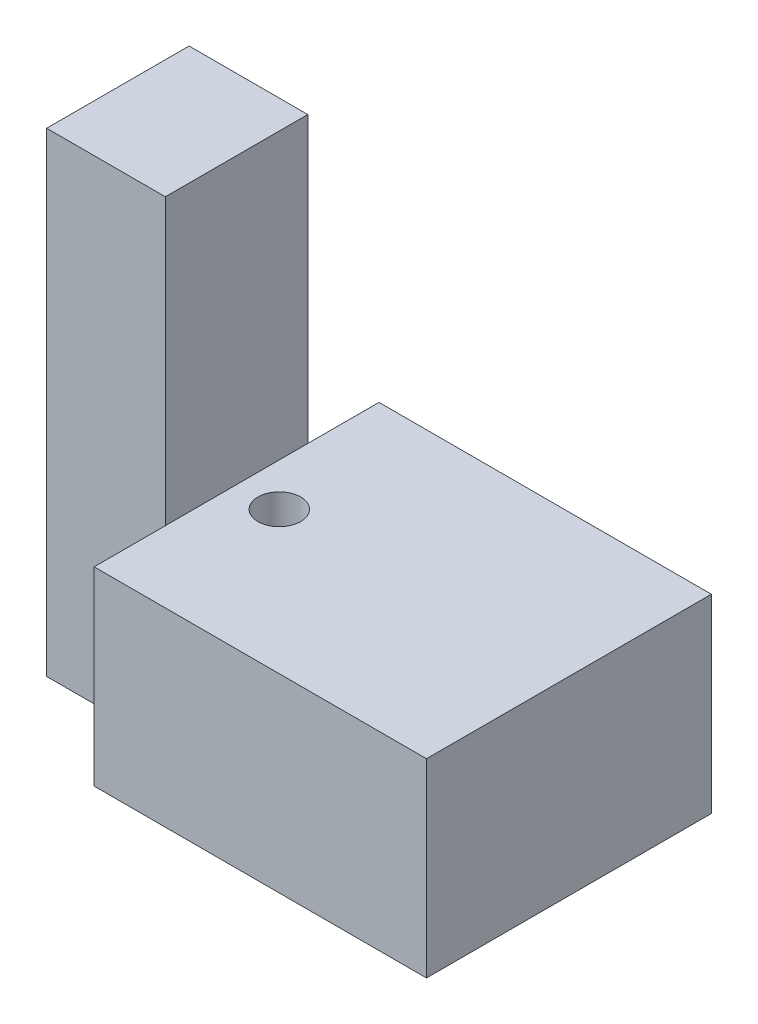
ISO-10303-21;
HEADER;
FILE_DESCRIPTION(('STEP AP214'),'2;1');
FILE_NAME('part.step','',(''),(''),'','','');
FILE_SCHEMA(('AUTOMOTIVE_DESIGN { 1 0 10303 214 1 1 1 1 }'));
ENDSEC;
DATA;
#1=APPLICATION_CONTEXT('core data for automotive mechanical design processes');
#2=APPLICATION_PROTOCOL_DEFINITION('international standard','automotive_design',2000,#1);
#3=PRODUCT_CONTEXT('',#1,'mechanical');
#4=PRODUCT('Part','Part','',(#3));
#5=PRODUCT_RELATED_PRODUCT_CATEGORY('part','',(#4));
#6=PRODUCT_DEFINITION_FORMATION('','',#4);
#7=PRODUCT_DEFINITION_CONTEXT('part definition',#1,'design');
#8=PRODUCT_DEFINITION('design','',#6,#7);
#9=PRODUCT_DEFINITION_SHAPE('','',#8);
#10=(LENGTH_UNIT() NAMED_UNIT(*) SI_UNIT(.MILLI.,.METRE.));
#11=(NAMED_UNIT(*) PLANE_ANGLE_UNIT() SI_UNIT($,.RADIAN.));
#12=(NAMED_UNIT(*) SI_UNIT($,.STERADIAN.) SOLID_ANGLE_UNIT());
#13=UNCERTAINTY_MEASURE_WITH_UNIT(LENGTH_MEASURE(1.E-05),#10,'distance_accuracy_value','');
#14=(GEOMETRIC_REPRESENTATION_CONTEXT(3) GLOBAL_UNCERTAINTY_ASSIGNED_CONTEXT((#13)) GLOBAL_UNIT_ASSIGNED_CONTEXT((#10,
#11,#12)) REPRESENTATION_CONTEXT('',''));
#15=CARTESIAN_POINT('',(0.,0.,0.));
#16=DIRECTION('',(0.,0.,1.));
#17=DIRECTION('',(1.,0.,0.));
#18=AXIS2_PLACEMENT_3D('',#15,#16,#17);
#19=CARTESIAN_POINT('',(-69.1350922818792,23.2641275167785,60.));
#20=DIRECTION('',(0.,-1.,0.));
#21=DIRECTION('',(0.,0.,-1.));
#22=AXIS2_PLACEMENT_3D('',#19,#20,#21);
#23=PLANE('',#22);
#24=CARTESIAN_POINT('',(-60.1350922818792,23.2641275167785,30.));
#25=DIRECTION('',(0.,1.,0.));
#26=DIRECTION('',(0.,0.,1.));
#27=AXIS2_PLACEMENT_3D('',#24,#25,#26);
#28=CIRCLE('',#27,4.5);
#29=CARTESIAN_POINT('',(-60.1350922818792,23.2641275167785,34.5));
#30=VERTEX_POINT('',#29);
#31=EDGE_CURVE('E167',#30,#30,#28,.T.);
#32=ORIENTED_EDGE('',*,*,#31,.F.);
#33=EDGE_LOOP('',(#32));
#34=FACE_BOUND('',#33,.T.);
#35=DIRECTION('',(0.,0.,-1.));
#36=VECTOR('',#35,1.);
#37=CARTESIAN_POINT('',(-69.1350922818792,23.2641275167785,15.));
#38=LINE('',#37,#36);
#39=CARTESIAN_POINT('',(-69.1350922818792,23.2641275167785,45.));
#40=VERTEX_POINT('',#39);
#41=CARTESIAN_POINT('',(-69.1350922818792,23.2641275167785,15.));
#42=VERTEX_POINT('',#41);
#43=EDGE_CURVE('E132',#40,#42,#38,.T.);
#44=ORIENTED_EDGE('',*,*,#43,.F.);
#45=DIRECTION('',(0.,0.,-1.));
#46=VECTOR('',#45,1.);
#47=CARTESIAN_POINT('',(-69.1350922818792,23.2641275167785,60.));
#48=LINE('',#47,#46);
#49=CARTESIAN_POINT('',(-69.1350922818792,23.2641275167785,60.));
#50=VERTEX_POINT('',#49);
#51=EDGE_CURVE('E196',#50,#40,#48,.T.);
#52=ORIENTED_EDGE('',*,*,#51,.F.);
#53=DIRECTION('',(-1.,0.,0.));
#54=VECTOR('',#53,1.);
#55=CARTESIAN_POINT('',(-69.1350922818792,23.2641275167785,60.));
#56=LINE('',#55,#54);
#57=CARTESIAN_POINT('',(0.864907718120811,23.2641275167785,60.));
#58=VERTEX_POINT('',#57);
#59=EDGE_CURVE('E183',#58,#50,#56,.T.);
#60=ORIENTED_EDGE('',*,*,#59,.F.);
#61=DIRECTION('',(0.,0.,-1.));
#62=VECTOR('',#61,1.);
#63=CARTESIAN_POINT('',(0.864907718120811,23.2641275167785,60.));
#64=LINE('',#63,#62);
#65=CARTESIAN_POINT('',(0.864907718120811,23.2641275167785,0.));
#66=VERTEX_POINT('',#65);
#67=EDGE_CURVE('E193',#58,#66,#64,.T.);
#68=ORIENTED_EDGE('',*,*,#67,.T.);
#69=DIRECTION('',(-1.,0.,0.));
#70=VECTOR('',#69,1.);
#71=CARTESIAN_POINT('',(-69.1350922818792,23.2641275167785,0.));
#72=LINE('',#71,#70);
#73=CARTESIAN_POINT('',(-69.1350922818792,23.2641275167785,0.));
#74=VERTEX_POINT('',#73);
#75=EDGE_CURVE('E179',#66,#74,#72,.T.);
#76=ORIENTED_EDGE('',*,*,#75,.T.);
#77=EDGE_CURVE('E160',#42,#74,#48,.T.);
#78=ORIENTED_EDGE('',*,*,#77,.F.);
#79=EDGE_LOOP('',(#44,#52,#60,#68,#76,#78));
#80=FACE_BOUND('',#79,.T.);
#81=ADVANCED_FACE('F33',(#34,#80),#23,.F.);
#82=CARTESIAN_POINT('',(-69.1350922818792,23.2641275167785,60.));
#83=DIRECTION('',(1.,0.,0.));
#84=DIRECTION('',(0.,0.,-1.));
#85=AXIS2_PLACEMENT_3D('',#82,#83,#84);
#86=PLANE('',#85);
#87=DIRECTION('',(0.,-1.,0.));
#88=VECTOR('',#87,1.);
#89=CARTESIAN_POINT('',(-69.1350922818792,23.2641275167785,15.));
#90=LINE('',#89,#88);
#91=CARTESIAN_POINT('',(-69.1350922818792,-16.7358724832215,15.));
#92=VERTEX_POINT('',#91);
#93=EDGE_CURVE('E146',#42,#92,#90,.T.);
#94=ORIENTED_EDGE('',*,*,#93,.F.);
#95=ORIENTED_EDGE('',*,*,#77,.T.);
#96=DIRECTION('',(0.,-1.,0.));
#97=VECTOR('',#96,1.);
#98=CARTESIAN_POINT('',(-69.1350922818792,23.2641275167785,0.));
#99=LINE('',#98,#97);
#100=CARTESIAN_POINT('',(-69.1350922818792,-16.7358724832215,0.));
#101=VERTEX_POINT('',#100);
#102=EDGE_CURVE('E174',#74,#101,#99,.T.);
#103=ORIENTED_EDGE('',*,*,#102,.T.);
#104=DIRECTION('',(0.,0.,-1.));
#105=VECTOR('',#104,1.);
#106=CARTESIAN_POINT('',(-69.1350922818792,-16.7358724832215,60.));
#107=LINE('',#106,#105);
#108=EDGE_CURVE('E42',#92,#101,#107,.T.);
#109=ORIENTED_EDGE('',*,*,#108,.F.);
#110=EDGE_LOOP('',(#94,#95,#103,#109));
#111=FACE_BOUND('',#110,.T.);
#112=ADVANCED_FACE('F35',(#111),#86,.F.);
#113=DIRECTION('',(0.,1.,0.));
#114=VECTOR('',#113,1.);
#115=CARTESIAN_POINT('',(-69.1350922818792,23.2641275167785,45.));
#116=LINE('',#115,#114);
#117=CARTESIAN_POINT('',(-69.1350922818792,-16.7358724832215,45.));
#118=VERTEX_POINT('',#117);
#119=EDGE_CURVE('E57',#118,#40,#116,.T.);
#120=ORIENTED_EDGE('',*,*,#119,.F.);
#121=CARTESIAN_POINT('',(-69.1350922818792,-16.7358724832215,60.));
#122=VERTEX_POINT('',#121);
#123=EDGE_CURVE('E11',#122,#118,#107,.T.);
#124=ORIENTED_EDGE('',*,*,#123,.F.);
#125=DIRECTION('',(0.,-1.,0.));
#126=VECTOR('',#125,1.);
#127=CARTESIAN_POINT('',(-69.1350922818792,23.2641275167785,60.));
#128=LINE('',#127,#126);
#129=EDGE_CURVE('E175',#50,#122,#128,.T.);
#130=ORIENTED_EDGE('',*,*,#129,.F.);
#131=ORIENTED_EDGE('',*,*,#51,.T.);
#132=EDGE_LOOP('',(#120,#124,#130,#131));
#133=FACE_BOUND('',#132,.T.);
#134=ADVANCED_FACE('F219',(#133),#86,.F.);
#135=CARTESIAN_POINT('',(-69.1350922818792,-16.7358724832215,60.));
#136=DIRECTION('',(0.,1.,0.));
#137=DIRECTION('',(0.,0.,1.));
#138=AXIS2_PLACEMENT_3D('',#135,#136,#137);
#139=PLANE('',#138);
#140=CARTESIAN_POINT('',(-60.1350922818792,-16.7358724832215,30.));
#141=DIRECTION('',(0.,1.,0.));
#142=DIRECTION('',(0.,0.,1.));
#143=AXIS2_PLACEMENT_3D('',#140,#141,#142);
#144=CIRCLE('',#143,4.5);
#145=CARTESIAN_POINT('',(-60.1350922818792,-16.7358724832215,34.5));
#146=VERTEX_POINT('',#145);
#147=EDGE_CURVE('E170',#146,#146,#144,.T.);
#148=ORIENTED_EDGE('',*,*,#147,.T.);
#149=EDGE_LOOP('',(#148));
#150=FACE_BOUND('',#149,.T.);
#151=DIRECTION('',(1.,0.,0.));
#152=VECTOR('',#151,1.);
#153=CARTESIAN_POINT('',(-69.1350922818792,-16.7358724832215,0.));
#154=LINE('',#153,#152);
#155=CARTESIAN_POINT('',(0.864907718120811,-16.7358724832215,0.));
#156=VERTEX_POINT('',#155);
#157=EDGE_CURVE('E186',#101,#156,#154,.T.);
#158=ORIENTED_EDGE('',*,*,#157,.T.);
#159=DIRECTION('',(0.,0.,-1.));
#160=VECTOR('',#159,1.);
#161=CARTESIAN_POINT('',(0.864907718120811,-16.7358724832215,60.));
#162=LINE('',#161,#160);
#163=CARTESIAN_POINT('',(0.864907718120811,-16.7358724832215,60.));
#164=VERTEX_POINT('',#163);
#165=EDGE_CURVE('E199',#164,#156,#162,.T.);
#166=ORIENTED_EDGE('',*,*,#165,.F.);
#167=DIRECTION('',(1.,0.,0.));
#168=VECTOR('',#167,1.);
#169=CARTESIAN_POINT('',(-69.1350922818792,-16.7358724832215,60.));
#170=LINE('',#169,#168);
#171=EDGE_CURVE('E178',#122,#164,#170,.T.);
#172=ORIENTED_EDGE('',*,*,#171,.F.);
#173=ORIENTED_EDGE('',*,*,#123,.T.);
#174=DIRECTION('',(1.,0.,0.));
#175=VECTOR('',#174,1.);
#176=CARTESIAN_POINT('',(-94.1350922818792,-16.7358724832215,45.));
#177=LINE('',#176,#175);
#178=CARTESIAN_POINT('',(-94.1350922818792,-16.7358724832215,45.));
#179=VERTEX_POINT('',#178);
#180=EDGE_CURVE('E117',#179,#118,#177,.T.);
#181=ORIENTED_EDGE('',*,*,#180,.F.);
#182=DIRECTION('',(0.,0.,1.));
#183=VECTOR('',#182,1.);
#184=CARTESIAN_POINT('',(-94.1350922818792,-16.7358724832215,15.));
#185=LINE('',#184,#183);
#186=CARTESIAN_POINT('',(-94.1350922818792,-16.7358724832215,15.));
#187=VERTEX_POINT('',#186);
#188=EDGE_CURVE('E113',#187,#179,#185,.T.);
#189=ORIENTED_EDGE('',*,*,#188,.F.);
#190=DIRECTION('',(1.,0.,0.));
#191=VECTOR('',#190,1.);
#192=CARTESIAN_POINT('',(-94.1350922818792,-16.7358724832215,15.));
#193=LINE('',#192,#191);
#194=EDGE_CURVE('E171',#187,#92,#193,.T.);
#195=ORIENTED_EDGE('',*,*,#194,.T.);
#196=ORIENTED_EDGE('',*,*,#108,.T.);
#197=EDGE_LOOP('',(#158,#166,#172,#173,#181,#189,#195,#196));
#198=FACE_BOUND('',#197,.T.);
#199=ADVANCED_FACE('F224',(#150,#198),#139,.F.);
#200=CARTESIAN_POINT('',(0.864907718120811,23.2641275167785,60.));
#201=DIRECTION('',(-1.,0.,0.));
#202=DIRECTION('',(0.,0.,1.));
#203=AXIS2_PLACEMENT_3D('',#200,#201,#202);
#204=PLANE('',#203);
#205=DIRECTION('',(0.,1.,0.));
#206=VECTOR('',#205,1.);
#207=CARTESIAN_POINT('',(0.864907718120811,23.2641275167785,0.));
#208=LINE('',#207,#206);
#209=EDGE_CURVE('E188',#156,#66,#208,.T.);
#210=ORIENTED_EDGE('',*,*,#209,.T.);
#211=ORIENTED_EDGE('',*,*,#67,.F.);
#212=DIRECTION('',(0.,1.,0.));
#213=VECTOR('',#212,1.);
#214=CARTESIAN_POINT('',(0.864907718120811,23.2641275167785,60.));
#215=LINE('',#214,#213);
#216=EDGE_CURVE('E181',#164,#58,#215,.T.);
#217=ORIENTED_EDGE('',*,*,#216,.F.);
#218=ORIENTED_EDGE('',*,*,#165,.T.);
#219=EDGE_LOOP('',(#210,#211,#217,#218));
#220=FACE_BOUND('',#219,.T.);
#221=ADVANCED_FACE('F222',(#220),#204,.F.);
#222=CARTESIAN_POINT('',(-69.1350922818792,-16.7358724832215,60.));
#223=DIRECTION('',(0.,0.,1.));
#224=DIRECTION('',(1.,0.,0.));
#225=AXIS2_PLACEMENT_3D('',#222,#223,#224);
#226=PLANE('',#225);
#227=ORIENTED_EDGE('',*,*,#129,.T.);
#228=ORIENTED_EDGE('',*,*,#171,.T.);
#229=ORIENTED_EDGE('',*,*,#216,.T.);
#230=ORIENTED_EDGE('',*,*,#59,.T.);
#231=EDGE_LOOP('',(#227,#228,#229,#230));
#232=FACE_BOUND('',#231,.T.);
#233=ADVANCED_FACE('F221',(#232),#226,.T.);
#234=CARTESIAN_POINT('',(-69.1350922818792,-16.7358724832215,0.));
#235=DIRECTION('',(0.,0.,1.));
#236=DIRECTION('',(1.,0.,0.));
#237=AXIS2_PLACEMENT_3D('',#234,#235,#236);
#238=PLANE('',#237);
#239=ORIENTED_EDGE('',*,*,#102,.F.);
#240=ORIENTED_EDGE('',*,*,#75,.F.);
#241=ORIENTED_EDGE('',*,*,#209,.F.);
#242=ORIENTED_EDGE('',*,*,#157,.F.);
#243=EDGE_LOOP('',(#239,#240,#241,#242));
#244=FACE_BOUND('',#243,.T.);
#245=ADVANCED_FACE('F215',(#244),#238,.F.);
#246=CARTESIAN_POINT('',(-60.1350922818792,-36.7358724832215,30.));
#247=DIRECTION('',(0.,1.,0.));
#248=DIRECTION('',(0.,0.,1.));
#249=AXIS2_PLACEMENT_3D('',#246,#247,#248);
#250=CYLINDRICAL_SURFACE('',#249,4.5);
#251=ORIENTED_EDGE('',*,*,#31,.T.);
#252=EDGE_LOOP('',(#251));
#253=FACE_BOUND('',#252,.T.);
#254=ORIENTED_EDGE('',*,*,#147,.F.);
#255=EDGE_LOOP('',(#254));
#256=FACE_BOUND('',#255,.T.);
#257=ADVANCED_FACE('F241',(#253,#256),#250,.F.);
#258=CARTESIAN_POINT('',(-94.1350922818792,23.2641275167785,15.));
#259=DIRECTION('',(0.,0.,1.));
#260=DIRECTION('',(0.,-1.,0.));
#261=AXIS2_PLACEMENT_3D('',#258,#259,#260);
#262=PLANE('',#261);
#263=ORIENTED_EDGE('',*,*,#93,.T.);
#264=ORIENTED_EDGE('',*,*,#194,.F.);
#265=DIRECTION('',(0.,-1.,0.));
#266=VECTOR('',#265,1.);
#267=CARTESIAN_POINT('',(-94.1350922818792,23.2641275167785,15.));
#268=LINE('',#267,#266);
#269=CARTESIAN_POINT('',(-94.1350922818792,83.2641275167785,15.));
#270=VERTEX_POINT('',#269);
#271=EDGE_CURVE('E142',#270,#187,#268,.T.);
#272=ORIENTED_EDGE('',*,*,#271,.F.);
#273=DIRECTION('',(-1.,0.,0.));
#274=VECTOR('',#273,1.);
#275=CARTESIAN_POINT('',(-94.1350922818792,83.2641275167785,15.));
#276=LINE('',#275,#274);
#277=CARTESIAN_POINT('',(-69.1350922818792,83.2641275167785,15.));
#278=VERTEX_POINT('',#277);
#279=EDGE_CURVE('E131',#278,#270,#276,.T.);
#280=ORIENTED_EDGE('',*,*,#279,.F.);
#281=DIRECTION('',(0.,-1.,0.));
#282=VECTOR('',#281,1.);
#283=CARTESIAN_POINT('',(-69.1350922818792,83.2641275167785,15.));
#284=LINE('',#283,#282);
#285=EDGE_CURVE('E139',#278,#42,#284,.T.);
#286=ORIENTED_EDGE('',*,*,#285,.T.);
#287=EDGE_LOOP('',(#263,#264,#272,#280,#286));
#288=FACE_BOUND('',#287,.T.);
#289=ADVANCED_FACE('F245',(#288),#262,.F.);
#290=CARTESIAN_POINT('',(-94.1350922818792,23.2641275167785,45.));
#291=DIRECTION('',(0.,0.,-1.));
#292=DIRECTION('',(0.,1.,0.));
#293=AXIS2_PLACEMENT_3D('',#290,#291,#292);
#294=PLANE('',#293);
#295=ORIENTED_EDGE('',*,*,#119,.T.);
#296=DIRECTION('',(0.,-1.,0.));
#297=VECTOR('',#296,1.);
#298=CARTESIAN_POINT('',(-69.1350922818792,83.2641275167785,45.));
#299=LINE('',#298,#297);
#300=CARTESIAN_POINT('',(-69.1350922818792,83.2641275167785,45.));
#301=VERTEX_POINT('',#300);
#302=EDGE_CURVE('E123',#301,#40,#299,.T.);
#303=ORIENTED_EDGE('',*,*,#302,.F.);
#304=DIRECTION('',(1.,0.,0.));
#305=VECTOR('',#304,1.);
#306=CARTESIAN_POINT('',(-94.1350922818792,83.2641275167785,45.));
#307=LINE('',#306,#305);
#308=CARTESIAN_POINT('',(-94.1350922818792,83.2641275167785,45.));
#309=VERTEX_POINT('',#308);
#310=EDGE_CURVE('E120',#309,#301,#307,.T.);
#311=ORIENTED_EDGE('',*,*,#310,.F.);
#312=DIRECTION('',(0.,1.,0.));
#313=VECTOR('',#312,1.);
#314=CARTESIAN_POINT('',(-94.1350922818792,23.2641275167785,45.));
#315=LINE('',#314,#313);
#316=EDGE_CURVE('E107',#179,#309,#315,.T.);
#317=ORIENTED_EDGE('',*,*,#316,.F.);
#318=ORIENTED_EDGE('',*,*,#180,.T.);
#319=EDGE_LOOP('',(#295,#303,#311,#317,#318));
#320=FACE_BOUND('',#319,.T.);
#321=ADVANCED_FACE('F121',(#320),#294,.F.);
#322=CARTESIAN_POINT('',(-94.1350922818792,-16.7358724832215,15.));
#323=DIRECTION('',(-1.,0.,0.));
#324=DIRECTION('',(0.,0.,1.));
#325=AXIS2_PLACEMENT_3D('',#322,#323,#324);
#326=PLANE('',#325);
#327=ORIENTED_EDGE('',*,*,#271,.T.);
#328=ORIENTED_EDGE('',*,*,#188,.T.);
#329=ORIENTED_EDGE('',*,*,#316,.T.);
#330=DIRECTION('',(0.,0.,1.));
#331=VECTOR('',#330,1.);
#332=CARTESIAN_POINT('',(-94.1350922818792,83.2641275167785,15.));
#333=LINE('',#332,#331);
#334=EDGE_CURVE('E112',#270,#309,#333,.T.);
#335=ORIENTED_EDGE('',*,*,#334,.F.);
#336=EDGE_LOOP('',(#327,#328,#329,#335));
#337=FACE_BOUND('',#336,.T.);
#338=ADVANCED_FACE('F110',(#337),#326,.T.);
#339=CARTESIAN_POINT('',(-69.1350922818792,83.2641275167785,15.));
#340=DIRECTION('',(-1.,0.,0.));
#341=DIRECTION('',(0.,0.,1.));
#342=AXIS2_PLACEMENT_3D('',#339,#340,#341);
#343=PLANE('',#342);
#344=ORIENTED_EDGE('',*,*,#43,.T.);
#345=ORIENTED_EDGE('',*,*,#285,.F.);
#346=DIRECTION('',(0.,0.,-1.));
#347=VECTOR('',#346,1.);
#348=CARTESIAN_POINT('',(-69.1350922818792,83.2641275167785,15.));
#349=LINE('',#348,#347);
#350=EDGE_CURVE('E126',#301,#278,#349,.T.);
#351=ORIENTED_EDGE('',*,*,#350,.F.);
#352=ORIENTED_EDGE('',*,*,#302,.T.);
#353=EDGE_LOOP('',(#344,#345,#351,#352));
#354=FACE_BOUND('',#353,.T.);
#355=ADVANCED_FACE('F253',(#354),#343,.F.);
#356=CARTESIAN_POINT('',(-94.1350922818792,83.2641275167785,45.));
#357=DIRECTION('',(0.,1.,0.));
#358=DIRECTION('',(0.,0.,1.));
#359=AXIS2_PLACEMENT_3D('',#356,#357,#358);
#360=PLANE('',#359);
#361=ORIENTED_EDGE('',*,*,#334,.T.);
#362=ORIENTED_EDGE('',*,*,#310,.T.);
#363=ORIENTED_EDGE('',*,*,#350,.T.);
#364=ORIENTED_EDGE('',*,*,#279,.T.);
#365=EDGE_LOOP('',(#361,#362,#363,#364));
#366=FACE_BOUND('',#365,.T.);
#367=ADVANCED_FACE('F129',(#366),#360,.T.);
#368=CLOSED_SHELL('',(#81,#112,#134,#199,#221,#233,#245,#257,#289,#321,#338,#355,#367));
#369=MANIFOLD_SOLID_BREP('B2',#368);
#370=ADVANCED_BREP_SHAPE_REPRESENTATION('',(#18,#369),#14);
#371=SHAPE_DEFINITION_REPRESENTATION(#9,#370);
ENDSEC;
END-ISO-10303-21;
